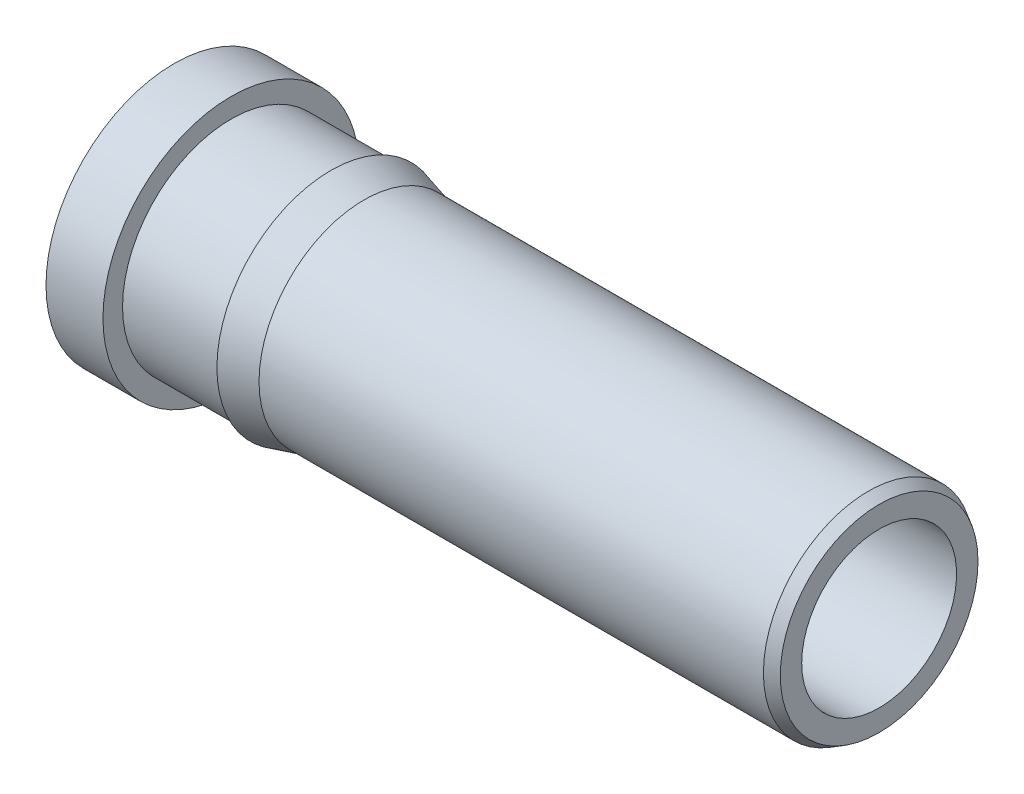
ISO-10303-21;
HEADER;
FILE_DESCRIPTION(('STEP AP214'),'2;1');
FILE_NAME('part.step','',(''),(''),'','','');
FILE_SCHEMA(('AUTOMOTIVE_DESIGN { 1 0 10303 214 1 1 1 1 }'));
ENDSEC;
DATA;
#1=APPLICATION_CONTEXT('core data for automotive mechanical design processes');
#2=APPLICATION_PROTOCOL_DEFINITION('international standard','automotive_design',2000,#1);
#3=PRODUCT_CONTEXT('',#1,'mechanical');
#4=PRODUCT('Part','Part','',(#3));
#5=PRODUCT_RELATED_PRODUCT_CATEGORY('part','',(#4));
#6=PRODUCT_DEFINITION_FORMATION('','',#4);
#7=PRODUCT_DEFINITION_CONTEXT('part definition',#1,'design');
#8=PRODUCT_DEFINITION('design','',#6,#7);
#9=PRODUCT_DEFINITION_SHAPE('','',#8);
#10=(LENGTH_UNIT() NAMED_UNIT(*) SI_UNIT(.MILLI.,.METRE.));
#11=(NAMED_UNIT(*) PLANE_ANGLE_UNIT() SI_UNIT($,.RADIAN.));
#12=(NAMED_UNIT(*) SI_UNIT($,.STERADIAN.) SOLID_ANGLE_UNIT());
#13=UNCERTAINTY_MEASURE_WITH_UNIT(LENGTH_MEASURE(1.E-05),#10,'distance_accuracy_value','');
#14=(GEOMETRIC_REPRESENTATION_CONTEXT(3) GLOBAL_UNCERTAINTY_ASSIGNED_CONTEXT((#13)) GLOBAL_UNIT_ASSIGNED_CONTEXT((#10,
#11,#12)) REPRESENTATION_CONTEXT('',''));
#15=CARTESIAN_POINT('',(0.,0.,0.));
#16=DIRECTION('',(0.,0.,1.));
#17=DIRECTION('',(1.,0.,0.));
#18=AXIS2_PLACEMENT_3D('',#15,#16,#17);
#19=CARTESIAN_POINT('',(5.02920000000003,0.705305909487725,0.));
#20=DIRECTION('',(-1.,0.,0.));
#21=DIRECTION('',(0.,0.,1.));
#22=AXIS2_PLACEMENT_3D('',#19,#20,#21);
#23=PLANE('',#22);
#24=CARTESIAN_POINT('',(5.02920000000004,0.,0.));
#25=DIRECTION('',(-1.,0.,0.));
#26=DIRECTION('',(0.,0.,1.));
#27=AXIS2_PLACEMENT_3D('',#24,#25,#26);
#28=CIRCLE('',#27,0.552449999999999);
#29=CARTESIAN_POINT('',(5.02920000000004,0.,0.552449999999999));
#30=VERTEX_POINT('',#29);
#31=EDGE_CURVE('E68',#30,#30,#28,.T.);
#32=ORIENTED_EDGE('',*,*,#31,.T.);
#33=EDGE_LOOP('',(#32));
#34=FACE_BOUND('',#33,.T.);
#35=CARTESIAN_POINT('',(5.02920000000001,0.,0.));
#36=DIRECTION('',(-1.,0.,0.));
#37=DIRECTION('',(0.,0.,1.));
#38=AXIS2_PLACEMENT_3D('',#35,#36,#37);
#39=CIRCLE('',#38,0.705305909487725);
#40=CARTESIAN_POINT('',(5.02920000000001,0.,0.705305909487725));
#41=VERTEX_POINT('',#40);
#42=EDGE_CURVE('E10',#41,#41,#39,.T.);
#43=ORIENTED_EDGE('',*,*,#42,.F.);
#44=EDGE_LOOP('',(#43));
#45=FACE_BOUND('',#44,.T.);
#46=ADVANCED_FACE('F31',(#34,#45),#23,.F.);
#47=CARTESIAN_POINT('',(5.02920000000001,0.,0.));
#48=DIRECTION('',(-1.,0.,0.));
#49=DIRECTION('',(0.,0.,1.));
#50=AXIS2_PLACEMENT_3D('',#47,#48,#49);
#51=CONICAL_SURFACE('',#50,0.705305909487725,0.523598775598529);
#52=CARTESIAN_POINT('',(4.95300000000004,0.,0.));
#53=DIRECTION('',(-1.,0.,0.));
#54=DIRECTION('',(0.,0.,1.));
#55=AXIS2_PLACEMENT_3D('',#52,#53,#54);
#56=CIRCLE('',#55,0.749299999999981);
#57=CARTESIAN_POINT('',(4.95300000000004,0.,0.749299999999981));
#58=VERTEX_POINT('',#57);
#59=EDGE_CURVE('E38',#58,#58,#56,.T.);
#60=ORIENTED_EDGE('',*,*,#59,.F.);
#61=EDGE_LOOP('',(#60));
#62=FACE_BOUND('',#61,.T.);
#63=ORIENTED_EDGE('',*,*,#42,.T.);
#64=EDGE_LOOP('',(#63));
#65=FACE_BOUND('',#64,.T.);
#66=ADVANCED_FACE('F89',(#62,#65),#51,.T.);
#67=CARTESIAN_POINT('',(0.,0.,0.));
#68=DIRECTION('',(-1.,0.,0.));
#69=DIRECTION('',(0.,0.,1.));
#70=AXIS2_PLACEMENT_3D('',#67,#68,#69);
#71=CYLINDRICAL_SURFACE('',#70,0.749299999999981);
#72=CARTESIAN_POINT('',(1.35458522628059,0.,0.));
#73=DIRECTION('',(-1.,0.,0.));
#74=DIRECTION('',(0.,0.,1.));
#75=AXIS2_PLACEMENT_3D('',#72,#73,#74);
#76=CIRCLE('',#75,0.749299999999981);
#77=CARTESIAN_POINT('',(1.35458522628059,0.,0.749299999999981));
#78=VERTEX_POINT('',#77);
#79=EDGE_CURVE('E42',#78,#78,#76,.T.);
#80=ORIENTED_EDGE('',*,*,#79,.F.);
#81=EDGE_LOOP('',(#80));
#82=FACE_BOUND('',#81,.T.);
#83=ORIENTED_EDGE('',*,*,#59,.T.);
#84=EDGE_LOOP('',(#83));
#85=FACE_BOUND('',#84,.T.);
#86=ADVANCED_FACE('F93',(#82,#85),#71,.T.);
#87=CARTESIAN_POINT('',(1.35458522628059,0.,0.));
#88=DIRECTION('',(-1.,0.,0.));
#89=DIRECTION('',(0.,0.,1.));
#90=AXIS2_PLACEMENT_3D('',#87,#88,#89);
#91=CONICAL_SURFACE('',#90,0.749299999999981,0.261799387799376);
#92=CARTESIAN_POINT('',(1.1176,0.,0.));
#93=DIRECTION('',(-1.,0.,0.));
#94=DIRECTION('',(0.,0.,1.));
#95=AXIS2_PLACEMENT_3D('',#92,#93,#94);
#96=CIRCLE('',#95,0.81280000000003);
#97=CARTESIAN_POINT('',(1.1176,0.,0.81280000000003));
#98=VERTEX_POINT('',#97);
#99=EDGE_CURVE('E47',#98,#98,#96,.T.);
#100=ORIENTED_EDGE('',*,*,#99,.F.);
#101=EDGE_LOOP('',(#100));
#102=FACE_BOUND('',#101,.T.);
#103=ORIENTED_EDGE('',*,*,#79,.T.);
#104=EDGE_LOOP('',(#103));
#105=FACE_BOUND('',#104,.T.);
#106=ADVANCED_FACE('F99',(#102,#105),#91,.T.);
#107=CARTESIAN_POINT('',(1.1176,0.774699999999989,0.));
#108=DIRECTION('',(1.,0.,0.));
#109=DIRECTION('',(0.,0.,-1.));
#110=AXIS2_PLACEMENT_3D('',#107,#108,#109);
#111=PLANE('',#110);
#112=CARTESIAN_POINT('',(1.1176,0.,0.));
#113=DIRECTION('',(-1.,0.,0.));
#114=DIRECTION('',(0.,0.,1.));
#115=AXIS2_PLACEMENT_3D('',#112,#113,#114);
#116=CIRCLE('',#115,0.774699999999989);
#117=CARTESIAN_POINT('',(1.1176,0.,0.774699999999989));
#118=VERTEX_POINT('',#117);
#119=EDGE_CURVE('E50',#118,#118,#116,.T.);
#120=ORIENTED_EDGE('',*,*,#119,.F.);
#121=EDGE_LOOP('',(#120));
#122=FACE_BOUND('',#121,.T.);
#123=ORIENTED_EDGE('',*,*,#99,.T.);
#124=EDGE_LOOP('',(#123));
#125=FACE_BOUND('',#124,.T.);
#126=ADVANCED_FACE('F106',(#122,#125),#111,.F.);
#127=CARTESIAN_POINT('',(0.,0.,0.));
#128=DIRECTION('',(-1.,0.,0.));
#129=DIRECTION('',(0.,0.,1.));
#130=AXIS2_PLACEMENT_3D('',#127,#128,#129);
#131=CYLINDRICAL_SURFACE('',#130,0.774699999999989);
#132=CARTESIAN_POINT('',(0.406400000000029,0.,0.));
#133=DIRECTION('',(-1.,0.,0.));
#134=DIRECTION('',(0.,0.,1.));
#135=AXIS2_PLACEMENT_3D('',#132,#133,#134);
#136=CIRCLE('',#135,0.774699999999989);
#137=CARTESIAN_POINT('',(0.406400000000029,0.,0.774699999999989));
#138=VERTEX_POINT('',#137);
#139=EDGE_CURVE('E53',#138,#138,#136,.T.);
#140=ORIENTED_EDGE('',*,*,#139,.F.);
#141=EDGE_LOOP('',(#140));
#142=FACE_BOUND('',#141,.T.);
#143=ORIENTED_EDGE('',*,*,#119,.T.);
#144=EDGE_LOOP('',(#143));
#145=FACE_BOUND('',#144,.T.);
#146=ADVANCED_FACE('F110',(#142,#145),#131,.T.);
#147=CARTESIAN_POINT('',(0.406400000000015,0.9144,0.));
#148=DIRECTION('',(-1.,0.,0.));
#149=DIRECTION('',(0.,0.,1.));
#150=AXIS2_PLACEMENT_3D('',#147,#148,#149);
#151=PLANE('',#150);
#152=CARTESIAN_POINT('',(0.406400000000001,0.,0.));
#153=DIRECTION('',(-1.,0.,0.));
#154=DIRECTION('',(0.,0.,1.));
#155=AXIS2_PLACEMENT_3D('',#152,#153,#154);
#156=CIRCLE('',#155,0.9144);
#157=CARTESIAN_POINT('',(0.406400000000001,0.,0.9144));
#158=VERTEX_POINT('',#157);
#159=EDGE_CURVE('E56',#158,#158,#156,.T.);
#160=ORIENTED_EDGE('',*,*,#159,.F.);
#161=EDGE_LOOP('',(#160));
#162=FACE_BOUND('',#161,.T.);
#163=ORIENTED_EDGE('',*,*,#139,.T.);
#164=EDGE_LOOP('',(#163));
#165=FACE_BOUND('',#164,.T.);
#166=ADVANCED_FACE('F114',(#162,#165),#151,.F.);
#167=CARTESIAN_POINT('',(0.,0.,0.));
#168=DIRECTION('',(-1.,0.,0.));
#169=DIRECTION('',(0.,0.,1.));
#170=AXIS2_PLACEMENT_3D('',#167,#168,#169);
#171=CYLINDRICAL_SURFACE('',#170,0.9144);
#172=CARTESIAN_POINT('',(0.,0.,0.));
#173=DIRECTION('',(-1.,0.,0.));
#174=DIRECTION('',(0.,0.,1.));
#175=AXIS2_PLACEMENT_3D('',#172,#173,#174);
#176=CIRCLE('',#175,0.9144);
#177=CARTESIAN_POINT('',(0.,0.,0.9144));
#178=VERTEX_POINT('',#177);
#179=EDGE_CURVE('E59',#178,#178,#176,.T.);
#180=ORIENTED_EDGE('',*,*,#179,.F.);
#181=EDGE_LOOP('',(#180));
#182=FACE_BOUND('',#181,.T.);
#183=ORIENTED_EDGE('',*,*,#159,.T.);
#184=EDGE_LOOP('',(#183));
#185=FACE_BOUND('',#184,.T.);
#186=ADVANCED_FACE('F118',(#182,#185),#171,.T.);
#187=CARTESIAN_POINT('',(0.,0.,0.));
#188=DIRECTION('',(1.,0.,0.));
#189=DIRECTION('',(0.,0.,-1.));
#190=AXIS2_PLACEMENT_3D('',#187,#188,#189);
#191=PLANE('',#190);
#192=CARTESIAN_POINT('',(0.,0.,0.));
#193=DIRECTION('',(-1.,0.,0.));
#194=DIRECTION('',(0.,0.,1.));
#195=AXIS2_PLACEMENT_3D('',#192,#193,#194);
#196=CIRCLE('',#195,0.647699999999999);
#197=CARTESIAN_POINT('',(0.,0.,0.647699999999999));
#198=VERTEX_POINT('',#197);
#199=EDGE_CURVE('E65',#198,#198,#196,.T.);
#200=ORIENTED_EDGE('',*,*,#199,.F.);
#201=EDGE_LOOP('',(#200));
#202=FACE_BOUND('',#201,.T.);
#203=ORIENTED_EDGE('',*,*,#179,.T.);
#204=EDGE_LOOP('',(#203));
#205=FACE_BOUND('',#204,.T.);
#206=ADVANCED_FACE('F122',(#202,#205),#191,.F.);
#207=CARTESIAN_POINT('',(2.3368,0.,0.));
#208=DIRECTION('',(-1.,0.,0.));
#209=DIRECTION('',(0.,0.,1.));
#210=AXIS2_PLACEMENT_3D('',#207,#208,#209);
#211=CONICAL_SURFACE('',#210,0.647699999999999,1.02974425867666);
#212=CARTESIAN_POINT('',(2.39403197396237,0.,0.));
#213=DIRECTION('',(-1.,0.,0.));
#214=DIRECTION('',(0.,0.,1.));
#215=AXIS2_PLACEMENT_3D('',#212,#213,#214);
#216=CIRCLE('',#215,0.552449999999999);
#217=CARTESIAN_POINT('',(2.39403197396237,0.,0.552449999999999));
#218=VERTEX_POINT('',#217);
#219=EDGE_CURVE('E34',#218,#218,#216,.F.);
#220=ORIENTED_EDGE('',*,*,#219,.T.);
#221=EDGE_LOOP('',(#220));
#222=FACE_BOUND('',#221,.T.);
#223=CARTESIAN_POINT('',(2.3368,0.,0.));
#224=DIRECTION('',(-1.,0.,0.));
#225=DIRECTION('',(0.,0.,1.));
#226=AXIS2_PLACEMENT_3D('',#223,#224,#225);
#227=CIRCLE('',#226,0.647699999999999);
#228=CARTESIAN_POINT('',(2.3368,0.,0.647699999999999));
#229=VERTEX_POINT('',#228);
#230=EDGE_CURVE('E62',#229,#229,#227,.T.);
#231=ORIENTED_EDGE('',*,*,#230,.T.);
#232=EDGE_LOOP('',(#231));
#233=FACE_BOUND('',#232,.T.);
#234=ADVANCED_FACE('F75',(#222,#233),#211,.F.);
#235=CARTESIAN_POINT('',(0.,0.,0.));
#236=DIRECTION('',(-1.,0.,0.));
#237=DIRECTION('',(0.,0.,1.));
#238=AXIS2_PLACEMENT_3D('',#235,#236,#237);
#239=CYLINDRICAL_SURFACE('',#238,0.647699999999999);
#240=ORIENTED_EDGE('',*,*,#230,.F.);
#241=EDGE_LOOP('',(#240));
#242=FACE_BOUND('',#241,.T.);
#243=ORIENTED_EDGE('',*,*,#199,.T.);
#244=EDGE_LOOP('',(#243));
#245=FACE_BOUND('',#244,.T.);
#246=ADVANCED_FACE('F80',(#242,#245),#239,.F.);
#247=CARTESIAN_POINT('',(0.,0.,0.));
#248=DIRECTION('',(-1.,0.,0.));
#249=DIRECTION('',(0.,0.,1.));
#250=AXIS2_PLACEMENT_3D('',#247,#248,#249);
#251=CYLINDRICAL_SURFACE('',#250,0.552449999999999);
#252=ORIENTED_EDGE('',*,*,#31,.F.);
#253=EDGE_LOOP('',(#252));
#254=FACE_BOUND('',#253,.T.);
#255=ORIENTED_EDGE('',*,*,#219,.F.);
#256=EDGE_LOOP('',(#255));
#257=FACE_BOUND('',#256,.T.);
#258=ADVANCED_FACE('F78',(#254,#257),#251,.F.);
#259=CLOSED_SHELL('',(#46,#66,#86,#106,#126,#146,#166,#186,#206,#234,#246,#258));
#260=MANIFOLD_SOLID_BREP('B2',#259);
#261=ADVANCED_BREP_SHAPE_REPRESENTATION('',(#18,#260),#14);
#262=SHAPE_DEFINITION_REPRESENTATION(#9,#261);
ENDSEC;
END-ISO-10303-21;
